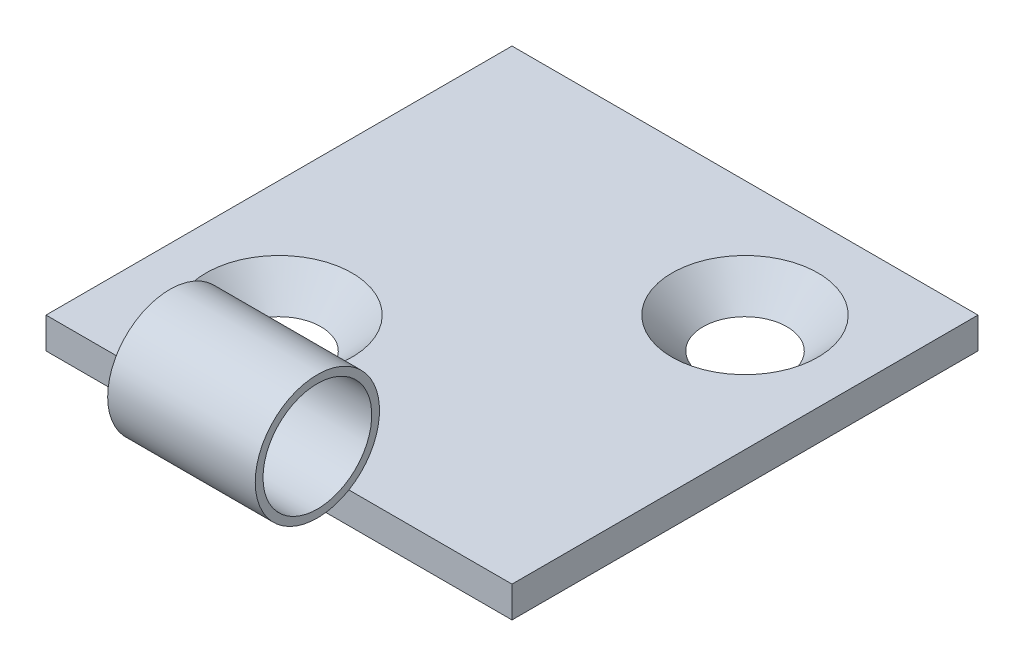
ISO-10303-21;
HEADER;
FILE_DESCRIPTION(('STEP AP214'),'2;1');
FILE_NAME('part.step','',(''),(''),'','','');
FILE_SCHEMA(('AUTOMOTIVE_DESIGN { 1 0 10303 214 1 1 1 1 }'));
ENDSEC;
DATA;
#1=APPLICATION_CONTEXT('core data for automotive mechanical design processes');
#2=APPLICATION_PROTOCOL_DEFINITION('international standard','automotive_design',2000,#1);
#3=PRODUCT_CONTEXT('',#1,'mechanical');
#4=PRODUCT('Part','Part','',(#3));
#5=PRODUCT_RELATED_PRODUCT_CATEGORY('part','',(#4));
#6=PRODUCT_DEFINITION_FORMATION('','',#4);
#7=PRODUCT_DEFINITION_CONTEXT('part definition',#1,'design');
#8=PRODUCT_DEFINITION('design','',#6,#7);
#9=PRODUCT_DEFINITION_SHAPE('','',#8);
#10=(LENGTH_UNIT() NAMED_UNIT(*) SI_UNIT(.MILLI.,.METRE.));
#11=(NAMED_UNIT(*) PLANE_ANGLE_UNIT() SI_UNIT($,.RADIAN.));
#12=(NAMED_UNIT(*) SI_UNIT($,.STERADIAN.) SOLID_ANGLE_UNIT());
#13=UNCERTAINTY_MEASURE_WITH_UNIT(LENGTH_MEASURE(1.E-05),#10,'distance_accuracy_value','');
#14=(GEOMETRIC_REPRESENTATION_CONTEXT(3) GLOBAL_UNCERTAINTY_ASSIGNED_CONTEXT((#13)) GLOBAL_UNIT_ASSIGNED_CONTEXT((#10,
#11,#12)) REPRESENTATION_CONTEXT('',''));
#15=CARTESIAN_POINT('',(0.,0.,0.));
#16=DIRECTION('',(0.,0.,1.));
#17=DIRECTION('',(1.,0.,0.));
#18=AXIS2_PLACEMENT_3D('',#15,#16,#17);
#19=CARTESIAN_POINT('',(-65.5554988387894,5.44660702720806,32.1462067798223));
#20=DIRECTION('',(-1.,0.,0.));
#21=DIRECTION('',(0.,0.,1.));
#22=AXIS2_PLACEMENT_3D('',#19,#20,#21);
#23=CYLINDRICAL_SURFACE('',#22,4.);
#24=CARTESIAN_POINT('',(-65.5554988387894,5.44660702720806,32.1462067798223));
#25=DIRECTION('',(-1.,0.,0.));
#26=DIRECTION('',(0.,0.,1.));
#27=AXIS2_PLACEMENT_3D('',#24,#25,#26);
#28=CIRCLE('',#27,4.);
#29=CARTESIAN_POINT('',(-65.5554988387894,5.44660702720806,36.1462067798223));
#30=VERTEX_POINT('',#29);
#31=EDGE_CURVE('E13',#30,#30,#28,.T.);
#32=ORIENTED_EDGE('',*,*,#31,.T.);
#33=EDGE_LOOP('',(#32));
#34=FACE_BOUND('',#33,.T.);
#35=CARTESIAN_POINT('',(-75.0554988387894,5.44660702720806,32.1462067798223));
#36=DIRECTION('',(-1.,0.,0.));
#37=DIRECTION('',(0.,0.,1.));
#38=AXIS2_PLACEMENT_3D('',#35,#36,#37);
#39=CIRCLE('',#38,4.);
#40=CARTESIAN_POINT('',(-75.0554988387894,5.44660702720806,36.1462067798223));
#41=VERTEX_POINT('',#40);
#42=EDGE_CURVE('E58',#41,#41,#39,.T.);
#43=ORIENTED_EDGE('',*,*,#42,.F.);
#44=EDGE_LOOP('',(#43));
#45=FACE_BOUND('',#44,.T.);
#46=ADVANCED_FACE('F55',(#34,#45),#23,.T.);
#47=CARTESIAN_POINT('',(-65.5554988387894,5.44660702720806,32.1462067798223));
#48=DIRECTION('',(-1.,0.,0.));
#49=DIRECTION('',(0.,0.,1.));
#50=AXIS2_PLACEMENT_3D('',#47,#48,#49);
#51=PLANE('',#50);
#52=CARTESIAN_POINT('',(-65.5554988387894,5.44660702720806,32.1462067798223));
#53=DIRECTION('',(-1.,0.,0.));
#54=DIRECTION('',(0.,0.,1.));
#55=AXIS2_PLACEMENT_3D('',#52,#53,#54);
#56=CIRCLE('',#55,3.5);
#57=CARTESIAN_POINT('',(-65.5554988387894,5.44660702720806,35.6462067798223));
#58=VERTEX_POINT('',#57);
#59=EDGE_CURVE('E65',#58,#58,#56,.T.);
#60=ORIENTED_EDGE('',*,*,#59,.T.);
#61=EDGE_LOOP('',(#60));
#62=FACE_BOUND('',#61,.T.);
#63=ORIENTED_EDGE('',*,*,#31,.F.);
#64=EDGE_LOOP('',(#63));
#65=FACE_BOUND('',#64,.T.);
#66=ADVANCED_FACE('F73',(#62,#65),#51,.F.);
#67=CARTESIAN_POINT('',(-75.0554988387894,5.44660702720806,32.1462067798223));
#68=DIRECTION('',(-1.,0.,0.));
#69=DIRECTION('',(0.,0.,1.));
#70=AXIS2_PLACEMENT_3D('',#67,#68,#69);
#71=PLANE('',#70);
#72=CARTESIAN_POINT('',(-75.0554988387894,5.44660702720806,32.1462067798223));
#73=DIRECTION('',(-1.,0.,0.));
#74=DIRECTION('',(0.,0.,1.));
#75=AXIS2_PLACEMENT_3D('',#72,#73,#74);
#76=CIRCLE('',#75,3.5);
#77=CARTESIAN_POINT('',(-75.0554988387894,5.44660702720806,35.6462067798223));
#78=VERTEX_POINT('',#77);
#79=EDGE_CURVE('E67',#78,#78,#76,.T.);
#80=ORIENTED_EDGE('',*,*,#79,.F.);
#81=EDGE_LOOP('',(#80));
#82=FACE_BOUND('',#81,.T.);
#83=ORIENTED_EDGE('',*,*,#42,.T.);
#84=EDGE_LOOP('',(#83));
#85=FACE_BOUND('',#84,.T.);
#86=ADVANCED_FACE('F79',(#82,#85),#71,.T.);
#87=CARTESIAN_POINT('',(-65.5554988387894,5.44660702720806,32.1462067798223));
#88=DIRECTION('',(-1.,0.,0.));
#89=DIRECTION('',(0.,0.,1.));
#90=AXIS2_PLACEMENT_3D('',#87,#88,#89);
#91=CYLINDRICAL_SURFACE('',#90,3.5);
#92=ORIENTED_EDGE('',*,*,#59,.F.);
#93=EDGE_LOOP('',(#92));
#94=FACE_BOUND('',#93,.T.);
#95=ORIENTED_EDGE('',*,*,#79,.T.);
#96=EDGE_LOOP('',(#95));
#97=FACE_BOUND('',#96,.T.);
#98=ADVANCED_FACE('F76',(#94,#97),#91,.F.);
#99=CLOSED_SHELL('',(#46,#66,#86,#98));
#100=MANIFOLD_SOLID_BREP('B2',#99);
#101=CARTESIAN_POINT('',(-85.0554988387894,2.,0.116206779822288));
#102=DIRECTION('',(1.,0.,0.));
#103=DIRECTION('',(0.,0.,-1.));
#104=AXIS2_PLACEMENT_3D('',#101,#102,#103);
#105=PLANE('',#104);
#106=DIRECTION('',(0.,0.,1.));
#107=VECTOR('',#106,1.);
#108=CARTESIAN_POINT('',(-85.0554988387894,0.,0.116206779822288));
#109=LINE('',#108,#107);
#110=CARTESIAN_POINT('',(-85.0554988387894,0.,0.116206779822288));
#111=VERTEX_POINT('',#110);
#112=CARTESIAN_POINT('',(-85.0554988387894,0.,30.1162067798223));
#113=VERTEX_POINT('',#112);
#114=EDGE_CURVE('E180',#111,#113,#109,.T.);
#115=ORIENTED_EDGE('',*,*,#114,.T.);
#116=DIRECTION('',(0.,-1.,0.));
#117=VECTOR('',#116,1.);
#118=CARTESIAN_POINT('',(-85.0554988387894,2.,30.1162067798223));
#119=LINE('',#118,#117);
#120=CARTESIAN_POINT('',(-85.0554988387894,2.,30.1162067798223));
#121=VERTEX_POINT('',#120);
#122=EDGE_CURVE('E53',#121,#113,#119,.T.);
#123=ORIENTED_EDGE('',*,*,#122,.F.);
#124=DIRECTION('',(0.,0.,1.));
#125=VECTOR('',#124,1.);
#126=CARTESIAN_POINT('',(-85.0554988387894,2.,0.116206779822288));
#127=LINE('',#126,#125);
#128=CARTESIAN_POINT('',(-85.0554988387894,2.,0.116206779822288));
#129=VERTEX_POINT('',#128);
#130=EDGE_CURVE('E168',#129,#121,#127,.T.);
#131=ORIENTED_EDGE('',*,*,#130,.F.);
#132=DIRECTION('',(0.,-1.,0.));
#133=VECTOR('',#132,1.);
#134=CARTESIAN_POINT('',(-85.0554988387894,2.,0.116206779822288));
#135=LINE('',#134,#133);
#136=EDGE_CURVE('E176',#129,#111,#135,.T.);
#137=ORIENTED_EDGE('',*,*,#136,.T.);
#138=EDGE_LOOP('',(#115,#123,#131,#137));
#139=FACE_BOUND('',#138,.T.);
#140=ADVANCED_FACE('F117',(#139),#105,.F.);
#141=CARTESIAN_POINT('',(-85.0554988387894,2.,30.1162067798223));
#142=DIRECTION('',(0.,0.,-1.));
#143=DIRECTION('',(-1.,0.,0.));
#144=AXIS2_PLACEMENT_3D('',#141,#142,#143);
#145=PLANE('',#144);
#146=DIRECTION('',(1.,0.,0.));
#147=VECTOR('',#146,1.);
#148=CARTESIAN_POINT('',(-85.0554988387894,0.,30.1162067798223));
#149=LINE('',#148,#147);
#150=CARTESIAN_POINT('',(-55.0554988387894,0.,30.1162067798223));
#151=VERTEX_POINT('',#150);
#152=EDGE_CURVE('E172',#113,#151,#149,.T.);
#153=ORIENTED_EDGE('',*,*,#152,.T.);
#154=DIRECTION('',(0.,-1.,0.));
#155=VECTOR('',#154,1.);
#156=CARTESIAN_POINT('',(-55.0554988387894,2.,30.1162067798223));
#157=LINE('',#156,#155);
#158=CARTESIAN_POINT('',(-55.0554988387894,2.,30.1162067798223));
#159=VERTEX_POINT('',#158);
#160=EDGE_CURVE('E125',#159,#151,#157,.T.);
#161=ORIENTED_EDGE('',*,*,#160,.F.);
#162=DIRECTION('',(1.,0.,0.));
#163=VECTOR('',#162,1.);
#164=CARTESIAN_POINT('',(-85.0554988387894,2.,30.1162067798223));
#165=LINE('',#164,#163);
#166=EDGE_CURVE('E163',#121,#159,#165,.T.);
#167=ORIENTED_EDGE('',*,*,#166,.F.);
#168=ORIENTED_EDGE('',*,*,#122,.T.);
#169=EDGE_LOOP('',(#153,#161,#167,#168));
#170=FACE_BOUND('',#169,.T.);
#171=ADVANCED_FACE('F171',(#170),#145,.F.);
#172=CARTESIAN_POINT('',(-55.0554988387894,2.,0.116206779822288));
#173=DIRECTION('',(-1.,0.,0.));
#174=DIRECTION('',(0.,0.,1.));
#175=AXIS2_PLACEMENT_3D('',#172,#173,#174);
#176=PLANE('',#175);
#177=DIRECTION('',(0.,0.,-1.));
#178=VECTOR('',#177,1.);
#179=CARTESIAN_POINT('',(-55.0554988387894,0.,0.116206779822288));
#180=LINE('',#179,#178);
#181=CARTESIAN_POINT('',(-55.0554988387894,0.,0.116206779822288));
#182=VERTEX_POINT('',#181);
#183=EDGE_CURVE('E150',#151,#182,#180,.T.);
#184=ORIENTED_EDGE('',*,*,#183,.T.);
#185=DIRECTION('',(0.,-1.,0.));
#186=VECTOR('',#185,1.);
#187=CARTESIAN_POINT('',(-55.0554988387894,2.,0.116206779822288));
#188=LINE('',#187,#186);
#189=CARTESIAN_POINT('',(-55.0554988387894,2.,0.116206779822288));
#190=VERTEX_POINT('',#189);
#191=EDGE_CURVE('E173',#190,#182,#188,.T.);
#192=ORIENTED_EDGE('',*,*,#191,.F.);
#193=DIRECTION('',(0.,0.,-1.));
#194=VECTOR('',#193,1.);
#195=CARTESIAN_POINT('',(-55.0554988387894,2.,0.116206779822288));
#196=LINE('',#195,#194);
#197=EDGE_CURVE('E166',#159,#190,#196,.T.);
#198=ORIENTED_EDGE('',*,*,#197,.F.);
#199=ORIENTED_EDGE('',*,*,#160,.T.);
#200=EDGE_LOOP('',(#184,#192,#198,#199));
#201=FACE_BOUND('',#200,.T.);
#202=ADVANCED_FACE('F174',(#201),#176,.F.);
#203=CARTESIAN_POINT('',(-85.0554988387894,2.,0.116206779822288));
#204=DIRECTION('',(0.,0.,1.));
#205=DIRECTION('',(1.,0.,0.));
#206=AXIS2_PLACEMENT_3D('',#203,#204,#205);
#207=PLANE('',#206);
#208=DIRECTION('',(-1.,0.,0.));
#209=VECTOR('',#208,1.);
#210=CARTESIAN_POINT('',(-85.0554988387894,0.,0.116206779822288));
#211=LINE('',#210,#209);
#212=EDGE_CURVE('E156',#182,#111,#211,.T.);
#213=ORIENTED_EDGE('',*,*,#212,.T.);
#214=ORIENTED_EDGE('',*,*,#136,.F.);
#215=DIRECTION('',(-1.,0.,0.));
#216=VECTOR('',#215,1.);
#217=CARTESIAN_POINT('',(-85.0554988387894,2.,0.116206779822288));
#218=LINE('',#217,#216);
#219=EDGE_CURVE('E133',#190,#129,#218,.T.);
#220=ORIENTED_EDGE('',*,*,#219,.F.);
#221=ORIENTED_EDGE('',*,*,#191,.T.);
#222=EDGE_LOOP('',(#213,#214,#220,#221));
#223=FACE_BOUND('',#222,.T.);
#224=ADVANCED_FACE('F188',(#223),#207,.F.);
#225=CARTESIAN_POINT('',(0.,2.,0.));
#226=DIRECTION('',(0.,1.,0.));
#227=DIRECTION('',(0.,0.,1.));
#228=AXIS2_PLACEMENT_3D('',#225,#226,#227);
#229=PLANE('',#228);
#230=CARTESIAN_POINT('',(-77.5554988387894,2.,22.6162067798223));
#231=DIRECTION('',(0.,1.,0.));
#232=DIRECTION('',(0.,0.,1.));
#233=AXIS2_PLACEMENT_3D('',#230,#231,#232);
#234=CIRCLE('',#233,4.7);
#235=CARTESIAN_POINT('',(-77.5554988387894,2.,27.3162067798223));
#236=VERTEX_POINT('',#235);
#237=EDGE_CURVE('E202',#236,#236,#234,.T.);
#238=ORIENTED_EDGE('',*,*,#237,.F.);
#239=EDGE_LOOP('',(#238));
#240=FACE_BOUND('',#239,.T.);
#241=CARTESIAN_POINT('',(-62.5554988387894,2.,7.61620677982229));
#242=DIRECTION('',(0.,1.,0.));
#243=DIRECTION('',(0.,0.,1.));
#244=AXIS2_PLACEMENT_3D('',#241,#242,#243);
#245=CIRCLE('',#244,4.7);
#246=CARTESIAN_POINT('',(-62.5554988387894,2.,12.3162067798223));
#247=VERTEX_POINT('',#246);
#248=EDGE_CURVE('E196',#247,#247,#245,.T.);
#249=ORIENTED_EDGE('',*,*,#248,.F.);
#250=EDGE_LOOP('',(#249));
#251=FACE_BOUND('',#250,.T.);
#252=ORIENTED_EDGE('',*,*,#130,.T.);
#253=ORIENTED_EDGE('',*,*,#166,.T.);
#254=ORIENTED_EDGE('',*,*,#197,.T.);
#255=ORIENTED_EDGE('',*,*,#219,.T.);
#256=EDGE_LOOP('',(#252,#253,#254,#255));
#257=FACE_BOUND('',#256,.T.);
#258=ADVANCED_FACE('F164',(#240,#251,#257),#229,.T.);
#259=CARTESIAN_POINT('',(0.,0.,0.));
#260=DIRECTION('',(0.,1.,0.));
#261=DIRECTION('',(0.,0.,1.));
#262=AXIS2_PLACEMENT_3D('',#259,#260,#261);
#263=PLANE('',#262);
#264=CARTESIAN_POINT('',(-77.5554988387894,0.,22.6162067798223));
#265=DIRECTION('',(0.,1.,0.));
#266=DIRECTION('',(0.,0.,1.));
#267=AXIS2_PLACEMENT_3D('',#264,#265,#266);
#268=CIRCLE('',#267,2.7);
#269=CARTESIAN_POINT('',(-77.5554988387894,0.,25.3162067798223));
#270=VERTEX_POINT('',#269);
#271=EDGE_CURVE('E199',#270,#270,#268,.T.);
#272=ORIENTED_EDGE('',*,*,#271,.T.);
#273=EDGE_LOOP('',(#272));
#274=FACE_BOUND('',#273,.T.);
#275=CARTESIAN_POINT('',(-62.5554988387894,0.,7.61620677982229));
#276=DIRECTION('',(0.,1.,0.));
#277=DIRECTION('',(0.,0.,1.));
#278=AXIS2_PLACEMENT_3D('',#275,#276,#277);
#279=CIRCLE('',#278,2.7);
#280=CARTESIAN_POINT('',(-62.5554988387894,0.,10.3162067798223));
#281=VERTEX_POINT('',#280);
#282=EDGE_CURVE('E183',#281,#281,#279,.T.);
#283=ORIENTED_EDGE('',*,*,#282,.T.);
#284=EDGE_LOOP('',(#283));
#285=FACE_BOUND('',#284,.T.);
#286=ORIENTED_EDGE('',*,*,#114,.F.);
#287=ORIENTED_EDGE('',*,*,#212,.F.);
#288=ORIENTED_EDGE('',*,*,#183,.F.);
#289=ORIENTED_EDGE('',*,*,#152,.F.);
#290=EDGE_LOOP('',(#286,#287,#288,#289));
#291=FACE_BOUND('',#290,.T.);
#292=ADVANCED_FACE('F191',(#274,#285,#291),#263,.F.);
#293=CARTESIAN_POINT('',(-62.5554988387894,2.,7.61620677982229));
#294=DIRECTION('',(0.,1.,0.));
#295=DIRECTION('',(0.,0.,1.));
#296=AXIS2_PLACEMENT_3D('',#293,#294,#295);
#297=CONICAL_SURFACE('',#296,4.7,0.78539816339745);
#298=ORIENTED_EDGE('',*,*,#248,.T.);
#299=EDGE_LOOP('',(#298));
#300=FACE_BOUND('',#299,.T.);
#301=ORIENTED_EDGE('',*,*,#282,.F.);
#302=EDGE_LOOP('',(#301));
#303=FACE_BOUND('',#302,.T.);
#304=ADVANCED_FACE('F214',(#300,#303),#297,.F.);
#305=CARTESIAN_POINT('',(-77.5554988387894,2.,22.6162067798223));
#306=DIRECTION('',(0.,1.,0.));
#307=DIRECTION('',(0.,0.,1.));
#308=AXIS2_PLACEMENT_3D('',#305,#306,#307);
#309=CONICAL_SURFACE('',#308,4.7,0.785398163397447);
#310=ORIENTED_EDGE('',*,*,#237,.T.);
#311=EDGE_LOOP('',(#310));
#312=FACE_BOUND('',#311,.T.);
#313=ORIENTED_EDGE('',*,*,#271,.F.);
#314=EDGE_LOOP('',(#313));
#315=FACE_BOUND('',#314,.T.);
#316=ADVANCED_FACE('F206',(#312,#315),#309,.F.);
#317=CLOSED_SHELL('',(#140,#171,#202,#224,#258,#292,#304,#316));
#318=MANIFOLD_SOLID_BREP('B8',#317);
#319=ADVANCED_BREP_SHAPE_REPRESENTATION('',(#18,#100,#318),#14);
#320=SHAPE_DEFINITION_REPRESENTATION(#9,#319);
ENDSEC;
END-ISO-10303-21;
